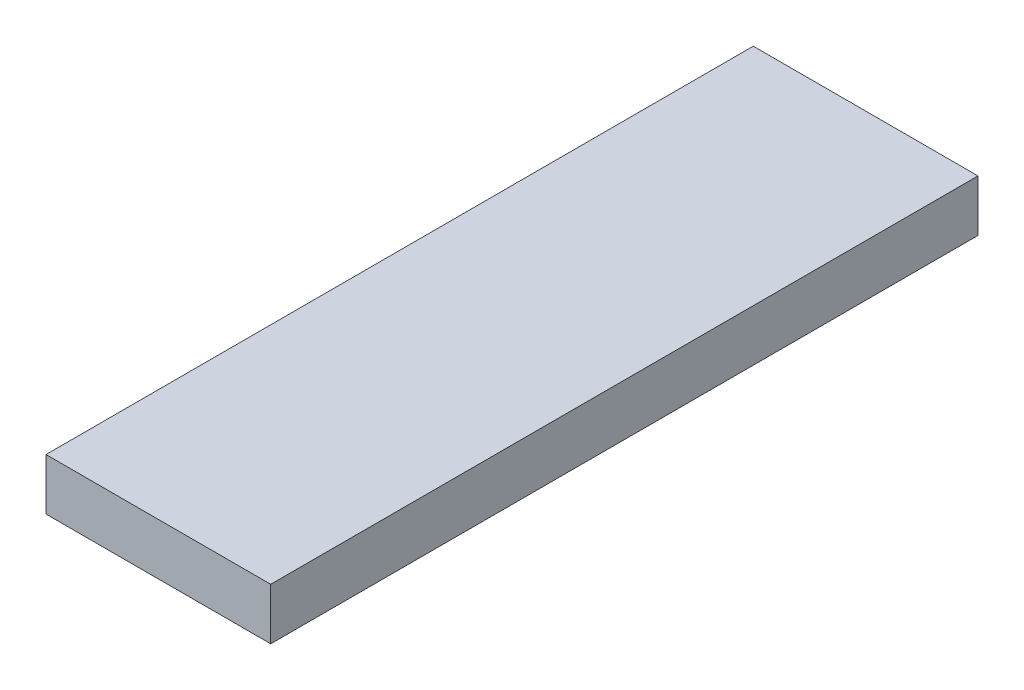
ISO-10303-21;
HEADER;
FILE_DESCRIPTION(('STEP AP214'),'2;1');
FILE_NAME('part.step','',(''),(''),'','','');
FILE_SCHEMA(('AUTOMOTIVE_DESIGN { 1 0 10303 214 1 1 1 1 }'));
ENDSEC;
DATA;
#1=APPLICATION_CONTEXT('core data for automotive mechanical design processes');
#2=APPLICATION_PROTOCOL_DEFINITION('international standard','automotive_design',2000,#1);
#3=PRODUCT_CONTEXT('',#1,'mechanical');
#4=PRODUCT('Part','Part','',(#3));
#5=PRODUCT_RELATED_PRODUCT_CATEGORY('part','',(#4));
#6=PRODUCT_DEFINITION_FORMATION('','',#4);
#7=PRODUCT_DEFINITION_CONTEXT('part definition',#1,'design');
#8=PRODUCT_DEFINITION('design','',#6,#7);
#9=PRODUCT_DEFINITION_SHAPE('','',#8);
#10=(LENGTH_UNIT() NAMED_UNIT(*) SI_UNIT(.MILLI.,.METRE.));
#11=(NAMED_UNIT(*) PLANE_ANGLE_UNIT() SI_UNIT($,.RADIAN.));
#12=(NAMED_UNIT(*) SI_UNIT($,.STERADIAN.) SOLID_ANGLE_UNIT());
#13=UNCERTAINTY_MEASURE_WITH_UNIT(LENGTH_MEASURE(1.E-05),#10,'distance_accuracy_value','');
#14=(GEOMETRIC_REPRESENTATION_CONTEXT(3) GLOBAL_UNCERTAINTY_ASSIGNED_CONTEXT((#13)) GLOBAL_UNIT_ASSIGNED_CONTEXT((#10,
#11,#12)) REPRESENTATION_CONTEXT('',''));
#15=CARTESIAN_POINT('',(0.,0.,0.));
#16=DIRECTION('',(0.,0.,1.));
#17=DIRECTION('',(1.,0.,0.));
#18=AXIS2_PLACEMENT_3D('',#15,#16,#17);
#19=CARTESIAN_POINT('',(193.675,88.9,-609.6));
#20=DIRECTION('',(-1.,0.,0.));
#21=DIRECTION('',(0.,0.,1.));
#22=AXIS2_PLACEMENT_3D('',#19,#20,#21);
#23=PLANE('',#22);
#24=DIRECTION('',(0.,0.,-1.));
#25=VECTOR('',#24,1.);
#26=CARTESIAN_POINT('',(193.675,0.,-609.6));
#27=LINE('',#26,#25);
#28=CARTESIAN_POINT('',(193.675,0.,609.6));
#29=VERTEX_POINT('',#28);
#30=CARTESIAN_POINT('',(193.675,0.,-609.6));
#31=VERTEX_POINT('',#30);
#32=EDGE_CURVE('E95',#29,#31,#27,.T.);
#33=ORIENTED_EDGE('',*,*,#32,.T.);
#34=DIRECTION('',(0.,-1.,0.));
#35=VECTOR('',#34,1.);
#36=CARTESIAN_POINT('',(193.675,88.9,-609.6));
#37=LINE('',#36,#35);
#38=CARTESIAN_POINT('',(193.675,88.9,-609.6));
#39=VERTEX_POINT('',#38);
#40=EDGE_CURVE('E11',#39,#31,#37,.T.);
#41=ORIENTED_EDGE('',*,*,#40,.F.);
#42=DIRECTION('',(0.,0.,-1.));
#43=VECTOR('',#42,1.);
#44=CARTESIAN_POINT('',(193.675,88.9,-609.6));
#45=LINE('',#44,#43);
#46=CARTESIAN_POINT('',(193.675,88.9,609.6));
#47=VERTEX_POINT('',#46);
#48=EDGE_CURVE('E83',#47,#39,#45,.T.);
#49=ORIENTED_EDGE('',*,*,#48,.F.);
#50=DIRECTION('',(0.,-1.,0.));
#51=VECTOR('',#50,1.);
#52=CARTESIAN_POINT('',(193.675,88.9,609.6));
#53=LINE('',#52,#51);
#54=EDGE_CURVE('E91',#47,#29,#53,.T.);
#55=ORIENTED_EDGE('',*,*,#54,.T.);
#56=EDGE_LOOP('',(#33,#41,#49,#55));
#57=FACE_BOUND('',#56,.T.);
#58=ADVANCED_FACE('F32',(#57),#23,.F.);
#59=CARTESIAN_POINT('',(-193.675,88.9,-609.6));
#60=DIRECTION('',(0.,0.,1.));
#61=DIRECTION('',(1.,0.,0.));
#62=AXIS2_PLACEMENT_3D('',#59,#60,#61);
#63=PLANE('',#62);
#64=DIRECTION('',(-1.,0.,0.));
#65=VECTOR('',#64,1.);
#66=CARTESIAN_POINT('',(-193.675,0.,-609.6));
#67=LINE('',#66,#65);
#68=CARTESIAN_POINT('',(-193.675,0.,-609.6));
#69=VERTEX_POINT('',#68);
#70=EDGE_CURVE('E87',#31,#69,#67,.T.);
#71=ORIENTED_EDGE('',*,*,#70,.T.);
#72=DIRECTION('',(0.,-1.,0.));
#73=VECTOR('',#72,1.);
#74=CARTESIAN_POINT('',(-193.675,88.9,-609.6));
#75=LINE('',#74,#73);
#76=CARTESIAN_POINT('',(-193.675,88.9,-609.6));
#77=VERTEX_POINT('',#76);
#78=EDGE_CURVE('E40',#77,#69,#75,.T.);
#79=ORIENTED_EDGE('',*,*,#78,.F.);
#80=DIRECTION('',(-1.,0.,0.));
#81=VECTOR('',#80,1.);
#82=CARTESIAN_POINT('',(-193.675,88.9,-609.6));
#83=LINE('',#82,#81);
#84=EDGE_CURVE('E78',#39,#77,#83,.T.);
#85=ORIENTED_EDGE('',*,*,#84,.F.);
#86=ORIENTED_EDGE('',*,*,#40,.T.);
#87=EDGE_LOOP('',(#71,#79,#85,#86));
#88=FACE_BOUND('',#87,.T.);
#89=ADVANCED_FACE('F86',(#88),#63,.F.);
#90=CARTESIAN_POINT('',(-193.675,88.9,-609.6));
#91=DIRECTION('',(1.,0.,0.));
#92=DIRECTION('',(0.,0.,-1.));
#93=AXIS2_PLACEMENT_3D('',#90,#91,#92);
#94=PLANE('',#93);
#95=DIRECTION('',(0.,0.,1.));
#96=VECTOR('',#95,1.);
#97=CARTESIAN_POINT('',(-193.675,0.,-609.6));
#98=LINE('',#97,#96);
#99=CARTESIAN_POINT('',(-193.675,0.,609.6));
#100=VERTEX_POINT('',#99);
#101=EDGE_CURVE('E65',#69,#100,#98,.T.);
#102=ORIENTED_EDGE('',*,*,#101,.T.);
#103=DIRECTION('',(0.,-1.,0.));
#104=VECTOR('',#103,1.);
#105=CARTESIAN_POINT('',(-193.675,88.9,609.6));
#106=LINE('',#105,#104);
#107=CARTESIAN_POINT('',(-193.675,88.9,609.6));
#108=VERTEX_POINT('',#107);
#109=EDGE_CURVE('E88',#108,#100,#106,.T.);
#110=ORIENTED_EDGE('',*,*,#109,.F.);
#111=DIRECTION('',(0.,0.,1.));
#112=VECTOR('',#111,1.);
#113=CARTESIAN_POINT('',(-193.675,88.9,-609.6));
#114=LINE('',#113,#112);
#115=EDGE_CURVE('E81',#77,#108,#114,.T.);
#116=ORIENTED_EDGE('',*,*,#115,.F.);
#117=ORIENTED_EDGE('',*,*,#78,.T.);
#118=EDGE_LOOP('',(#102,#110,#116,#117));
#119=FACE_BOUND('',#118,.T.);
#120=ADVANCED_FACE('F89',(#119),#94,.F.);
#121=CARTESIAN_POINT('',(-193.675,88.9,609.6));
#122=DIRECTION('',(0.,0.,-1.));
#123=DIRECTION('',(-1.,0.,0.));
#124=AXIS2_PLACEMENT_3D('',#121,#122,#123);
#125=PLANE('',#124);
#126=DIRECTION('',(1.,0.,0.));
#127=VECTOR('',#126,1.);
#128=CARTESIAN_POINT('',(-193.675,0.,609.6));
#129=LINE('',#128,#127);
#130=EDGE_CURVE('E71',#100,#29,#129,.T.);
#131=ORIENTED_EDGE('',*,*,#130,.T.);
#132=ORIENTED_EDGE('',*,*,#54,.F.);
#133=DIRECTION('',(1.,0.,0.));
#134=VECTOR('',#133,1.);
#135=CARTESIAN_POINT('',(-193.675,88.9,609.6));
#136=LINE('',#135,#134);
#137=EDGE_CURVE('E48',#108,#47,#136,.T.);
#138=ORIENTED_EDGE('',*,*,#137,.F.);
#139=ORIENTED_EDGE('',*,*,#109,.T.);
#140=EDGE_LOOP('',(#131,#132,#138,#139));
#141=FACE_BOUND('',#140,.T.);
#142=ADVANCED_FACE('F102',(#141),#125,.F.);
#143=CARTESIAN_POINT('',(0.,88.9,0.));
#144=DIRECTION('',(0.,1.,0.));
#145=DIRECTION('',(0.,0.,1.));
#146=AXIS2_PLACEMENT_3D('',#143,#144,#145);
#147=PLANE('',#146);
#148=ORIENTED_EDGE('',*,*,#48,.T.);
#149=ORIENTED_EDGE('',*,*,#84,.T.);
#150=ORIENTED_EDGE('',*,*,#115,.T.);
#151=ORIENTED_EDGE('',*,*,#137,.T.);
#152=EDGE_LOOP('',(#148,#149,#150,#151));
#153=FACE_BOUND('',#152,.T.);
#154=ADVANCED_FACE('F79',(#153),#147,.T.);
#155=CARTESIAN_POINT('',(0.,0.,0.));
#156=DIRECTION('',(0.,1.,0.));
#157=DIRECTION('',(0.,0.,1.));
#158=AXIS2_PLACEMENT_3D('',#155,#156,#157);
#159=PLANE('',#158);
#160=ORIENTED_EDGE('',*,*,#32,.F.);
#161=ORIENTED_EDGE('',*,*,#130,.F.);
#162=ORIENTED_EDGE('',*,*,#101,.F.);
#163=ORIENTED_EDGE('',*,*,#70,.F.);
#164=EDGE_LOOP('',(#160,#161,#162,#163));
#165=FACE_BOUND('',#164,.T.);
#166=ADVANCED_FACE('F105',(#165),#159,.F.);
#167=CLOSED_SHELL('',(#58,#89,#120,#142,#154,#166));
#168=MANIFOLD_SOLID_BREP('B2',#167);
#169=ADVANCED_BREP_SHAPE_REPRESENTATION('',(#18,#168),#14);
#170=SHAPE_DEFINITION_REPRESENTATION(#9,#169);
ENDSEC;
END-ISO-10303-21;
